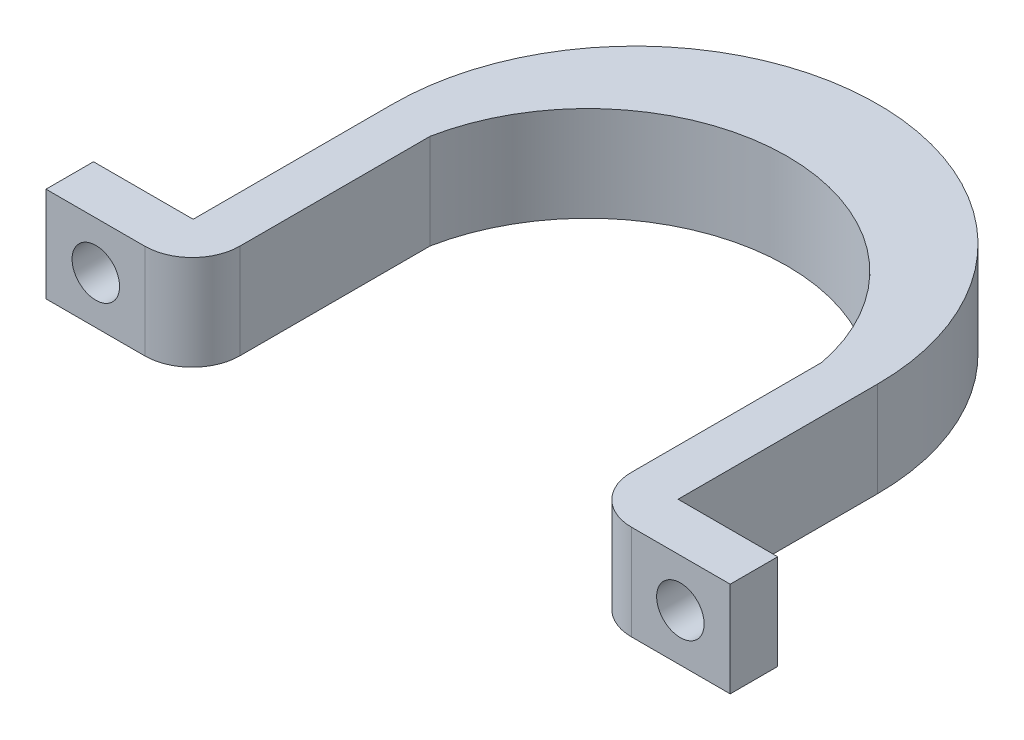
ISO-10303-21;
HEADER;
FILE_DESCRIPTION(('STEP AP214'),'2;1');
FILE_NAME('part.step','',(''),(''),'','','');
FILE_SCHEMA(('AUTOMOTIVE_DESIGN { 1 0 10303 214 1 1 1 1 }'));
ENDSEC;
DATA;
#1=APPLICATION_CONTEXT('core data for automotive mechanical design processes');
#2=APPLICATION_PROTOCOL_DEFINITION('international standard','automotive_design',2000,#1);
#3=PRODUCT_CONTEXT('',#1,'mechanical');
#4=PRODUCT('Part','Part','',(#3));
#5=PRODUCT_RELATED_PRODUCT_CATEGORY('part','',(#4));
#6=PRODUCT_DEFINITION_FORMATION('','',#4);
#7=PRODUCT_DEFINITION_CONTEXT('part definition',#1,'design');
#8=PRODUCT_DEFINITION('design','',#6,#7);
#9=PRODUCT_DEFINITION_SHAPE('','',#8);
#10=(LENGTH_UNIT() NAMED_UNIT(*) SI_UNIT(.MILLI.,.METRE.));
#11=(NAMED_UNIT(*) PLANE_ANGLE_UNIT() SI_UNIT($,.RADIAN.));
#12=(NAMED_UNIT(*) SI_UNIT($,.STERADIAN.) SOLID_ANGLE_UNIT());
#13=UNCERTAINTY_MEASURE_WITH_UNIT(LENGTH_MEASURE(1.E-05),#10,'distance_accuracy_value','');
#14=(GEOMETRIC_REPRESENTATION_CONTEXT(3) GLOBAL_UNCERTAINTY_ASSIGNED_CONTEXT((#13)) GLOBAL_UNIT_ASSIGNED_CONTEXT((#10,
#11,#12)) REPRESENTATION_CONTEXT('',''));
#15=CARTESIAN_POINT('',(0.,0.,0.));
#16=DIRECTION('',(0.,0.,1.));
#17=DIRECTION('',(1.,0.,0.));
#18=AXIS2_PLACEMENT_3D('',#15,#16,#17);
#19=CARTESIAN_POINT('',(0.,10.,-5.));
#20=DIRECTION('',(0.,-1.,0.));
#21=DIRECTION('',(0.,0.,-1.));
#22=AXIS2_PLACEMENT_3D('',#19,#20,#21);
#23=CYLINDRICAL_SURFACE('',#22,25.5147016443462);
#24=CARTESIAN_POINT('',(0.,0.,-5.));
#25=DIRECTION('',(0.,1.,0.));
#26=DIRECTION('',(0.,0.,-1.));
#27=AXIS2_PLACEMENT_3D('',#24,#25,#26);
#28=CIRCLE('',#27,25.5147016443462);
#29=CARTESIAN_POINT('',(25.5147016443462,0.,-5.));
#30=VERTEX_POINT('',#29);
#31=CARTESIAN_POINT('',(-25.5147016443462,0.,-5.));
#32=VERTEX_POINT('',#31);
#33=EDGE_CURVE('E169',#30,#32,#28,.T.);
#34=ORIENTED_EDGE('',*,*,#33,.T.);
#35=DIRECTION('',(0.,-1.,0.));
#36=VECTOR('',#35,1.);
#37=CARTESIAN_POINT('',(-25.5147016443462,10.,-5.));
#38=LINE('',#37,#36);
#39=CARTESIAN_POINT('',(-25.5147016443462,10.,-5.));
#40=VERTEX_POINT('',#39);
#41=EDGE_CURVE('E11',#40,#32,#38,.T.);
#42=ORIENTED_EDGE('',*,*,#41,.F.);
#43=CARTESIAN_POINT('',(0.,10.,-5.));
#44=DIRECTION('',(0.,1.,0.));
#45=DIRECTION('',(0.,0.,-1.));
#46=AXIS2_PLACEMENT_3D('',#43,#44,#45);
#47=CIRCLE('',#46,25.5147016443462);
#48=CARTESIAN_POINT('',(25.5147016443462,10.,-5.));
#49=VERTEX_POINT('',#48);
#50=EDGE_CURVE('E196',#49,#40,#47,.T.);
#51=ORIENTED_EDGE('',*,*,#50,.F.);
#52=DIRECTION('',(0.,-1.,0.));
#53=VECTOR('',#52,1.);
#54=CARTESIAN_POINT('',(25.5147016443462,10.,-5.));
#55=LINE('',#54,#53);
#56=EDGE_CURVE('E165',#49,#30,#55,.T.);
#57=ORIENTED_EDGE('',*,*,#56,.T.);
#58=EDGE_LOOP('',(#34,#42,#51,#57));
#59=FACE_BOUND('',#58,.T.);
#60=ADVANCED_FACE('F37',(#59),#23,.T.);
#61=CARTESIAN_POINT('',(-25.5147016443461,10.,16.));
#62=DIRECTION('',(1.,0.,0.));
#63=DIRECTION('',(0.,0.,-1.));
#64=AXIS2_PLACEMENT_3D('',#61,#62,#63);
#65=PLANE('',#64);
#66=DIRECTION('',(0.,0.,1.));
#67=VECTOR('',#66,1.);
#68=CARTESIAN_POINT('',(-25.5147016443461,0.,16.));
#69=LINE('',#68,#67);
#70=CARTESIAN_POINT('',(-25.5147016443461,0.,16.));
#71=VERTEX_POINT('',#70);
#72=EDGE_CURVE('E172',#32,#71,#69,.T.);
#73=ORIENTED_EDGE('',*,*,#72,.T.);
#74=DIRECTION('',(0.,-1.,0.));
#75=VECTOR('',#74,1.);
#76=CARTESIAN_POINT('',(-25.5147016443461,10.,16.));
#77=LINE('',#76,#75);
#78=CARTESIAN_POINT('',(-25.5147016443461,10.,16.));
#79=VERTEX_POINT('',#78);
#80=EDGE_CURVE('E45',#79,#71,#77,.T.);
#81=ORIENTED_EDGE('',*,*,#80,.F.);
#82=DIRECTION('',(0.,0.,1.));
#83=VECTOR('',#82,1.);
#84=CARTESIAN_POINT('',(-25.5147016443461,10.,16.));
#85=LINE('',#84,#83);
#86=EDGE_CURVE('E114',#40,#79,#85,.T.);
#87=ORIENTED_EDGE('',*,*,#86,.F.);
#88=ORIENTED_EDGE('',*,*,#41,.T.);
#89=EDGE_LOOP('',(#73,#81,#87,#88));
#90=FACE_BOUND('',#89,.T.);
#91=ADVANCED_FACE('F285',(#90),#65,.F.);
#92=CARTESIAN_POINT('',(-36.,10.,16.));
#93=DIRECTION('',(0.,0.,1.));
#94=DIRECTION('',(1.,0.,0.));
#95=AXIS2_PLACEMENT_3D('',#92,#93,#94);
#96=PLANE('',#95);
#97=CARTESIAN_POINT('',(-30.7573508221732,5.,15.9999999999998));
#98=DIRECTION('',(0.,0.,-1.));
#99=DIRECTION('',(1.,0.,0.));
#100=AXIS2_PLACEMENT_3D('',#97,#98,#99);
#101=CIRCLE('',#100,2.5);
#102=CARTESIAN_POINT('',(-28.2573508221732,5.,15.9999999999998));
#103=VERTEX_POINT('',#102);
#104=EDGE_CURVE('E475',#103,#103,#101,.T.);
#105=ORIENTED_EDGE('',*,*,#104,.F.);
#106=EDGE_LOOP('',(#105));
#107=FACE_BOUND('',#106,.T.);
#108=DIRECTION('',(-1.,0.,0.));
#109=VECTOR('',#108,1.);
#110=CARTESIAN_POINT('',(-36.,0.,16.));
#111=LINE('',#110,#109);
#112=CARTESIAN_POINT('',(-36.,0.,16.));
#113=VERTEX_POINT('',#112);
#114=EDGE_CURVE('E175',#71,#113,#111,.T.);
#115=ORIENTED_EDGE('',*,*,#114,.T.);
#116=DIRECTION('',(0.,-1.,0.));
#117=VECTOR('',#116,1.);
#118=CARTESIAN_POINT('',(-36.,10.,16.));
#119=LINE('',#118,#117);
#120=CARTESIAN_POINT('',(-36.,10.,16.));
#121=VERTEX_POINT('',#120);
#122=EDGE_CURVE('E221',#121,#113,#119,.T.);
#123=ORIENTED_EDGE('',*,*,#122,.F.);
#124=DIRECTION('',(-1.,0.,0.));
#125=VECTOR('',#124,1.);
#126=CARTESIAN_POINT('',(-36.,10.,16.));
#127=LINE('',#126,#125);
#128=EDGE_CURVE('E229',#79,#121,#127,.T.);
#129=ORIENTED_EDGE('',*,*,#128,.F.);
#130=ORIENTED_EDGE('',*,*,#80,.T.);
#131=EDGE_LOOP('',(#115,#123,#129,#130));
#132=FACE_BOUND('',#131,.T.);
#133=ADVANCED_FACE('F227',(#107,#132),#96,.F.);
#134=CARTESIAN_POINT('',(-36.,10.,21.));
#135=DIRECTION('',(1.,0.,0.));
#136=DIRECTION('',(0.,0.,-1.));
#137=AXIS2_PLACEMENT_3D('',#134,#135,#136);
#138=PLANE('',#137);
#139=DIRECTION('',(0.,0.,1.));
#140=VECTOR('',#139,1.);
#141=CARTESIAN_POINT('',(-36.,0.,21.));
#142=LINE('',#141,#140);
#143=CARTESIAN_POINT('',(-36.,0.,21.));
#144=VERTEX_POINT('',#143);
#145=EDGE_CURVE('E177',#113,#144,#142,.T.);
#146=ORIENTED_EDGE('',*,*,#145,.T.);
#147=DIRECTION('',(0.,-1.,0.));
#148=VECTOR('',#147,1.);
#149=CARTESIAN_POINT('',(-36.,10.,21.));
#150=LINE('',#149,#148);
#151=CARTESIAN_POINT('',(-36.,10.,21.));
#152=VERTEX_POINT('',#151);
#153=EDGE_CURVE('E218',#152,#144,#150,.T.);
#154=ORIENTED_EDGE('',*,*,#153,.F.);
#155=DIRECTION('',(0.,0.,1.));
#156=VECTOR('',#155,1.);
#157=CARTESIAN_POINT('',(-36.,10.,21.));
#158=LINE('',#157,#156);
#159=EDGE_CURVE('E247',#121,#152,#158,.T.);
#160=ORIENTED_EDGE('',*,*,#159,.F.);
#161=ORIENTED_EDGE('',*,*,#122,.T.);
#162=EDGE_LOOP('',(#146,#154,#160,#161));
#163=FACE_BOUND('',#162,.T.);
#164=ADVANCED_FACE('F238',(#163),#138,.F.);
#165=CARTESIAN_POINT('',(-25.6080282512027,10.,21.));
#166=DIRECTION('',(0.,0.,-1.));
#167=DIRECTION('',(-1.,0.,0.));
#168=AXIS2_PLACEMENT_3D('',#165,#166,#167);
#169=PLANE('',#168);
#170=CARTESIAN_POINT('',(-30.7573508221732,5.,21.));
#171=DIRECTION('',(0.,0.,-1.));
#172=DIRECTION('',(1.,0.,0.));
#173=AXIS2_PLACEMENT_3D('',#170,#171,#172);
#174=CIRCLE('',#173,2.5);
#175=CARTESIAN_POINT('',(-28.2573508221732,5.,21.));
#176=VERTEX_POINT('',#175);
#177=EDGE_CURVE('E472',#176,#176,#174,.T.);
#178=ORIENTED_EDGE('',*,*,#177,.T.);
#179=EDGE_LOOP('',(#178));
#180=FACE_BOUND('',#179,.T.);
#181=DIRECTION('',(1.,0.,0.));
#182=VECTOR('',#181,1.);
#183=CARTESIAN_POINT('',(-25.6080282512027,0.,21.));
#184=LINE('',#183,#182);
#185=CARTESIAN_POINT('',(-25.6080282512027,0.,21.));
#186=VERTEX_POINT('',#185);
#187=EDGE_CURVE('E179',#144,#186,#184,.T.);
#188=ORIENTED_EDGE('',*,*,#187,.T.);
#189=DIRECTION('',(0.,-1.,0.));
#190=VECTOR('',#189,1.);
#191=CARTESIAN_POINT('',(-25.6080282512027,10.,21.));
#192=LINE('',#191,#190);
#193=CARTESIAN_POINT('',(-25.6080282512027,10.,21.));
#194=VERTEX_POINT('',#193);
#195=EDGE_CURVE('E215',#194,#186,#192,.T.);
#196=ORIENTED_EDGE('',*,*,#195,.F.);
#197=DIRECTION('',(1.,0.,0.));
#198=VECTOR('',#197,1.);
#199=CARTESIAN_POINT('',(-25.6080282512027,10.,21.));
#200=LINE('',#199,#198);
#201=EDGE_CURVE('E244',#152,#194,#200,.T.);
#202=ORIENTED_EDGE('',*,*,#201,.F.);
#203=ORIENTED_EDGE('',*,*,#153,.T.);
#204=EDGE_LOOP('',(#188,#196,#202,#203));
#205=FACE_BOUND('',#204,.T.);
#206=ADVANCED_FACE('F242',(#180,#205),#169,.F.);
#207=CARTESIAN_POINT('',(-25.6080282512027,10.,16.));
#208=DIRECTION('',(0.,-1.,0.));
#209=DIRECTION('',(0.,0.,-1.));
#210=AXIS2_PLACEMENT_3D('',#207,#208,#209);
#211=CYLINDRICAL_SURFACE('',#210,5.);
#212=CARTESIAN_POINT('',(-25.6080282512027,0.,16.));
#213=DIRECTION('',(0.,1.,0.));
#214=DIRECTION('',(0.,0.,-1.));
#215=AXIS2_PLACEMENT_3D('',#212,#213,#214);
#216=CIRCLE('',#215,5.);
#217=CARTESIAN_POINT('',(-20.6080282512027,0.,16.));
#218=VERTEX_POINT('',#217);
#219=EDGE_CURVE('E181',#186,#218,#216,.T.);
#220=ORIENTED_EDGE('',*,*,#219,.T.);
#221=DIRECTION('',(0.,-1.,0.));
#222=VECTOR('',#221,1.);
#223=CARTESIAN_POINT('',(-20.6080282512027,10.,16.));
#224=LINE('',#223,#222);
#225=CARTESIAN_POINT('',(-20.6080282512027,10.,16.));
#226=VERTEX_POINT('',#225);
#227=EDGE_CURVE('E212',#226,#218,#224,.T.);
#228=ORIENTED_EDGE('',*,*,#227,.F.);
#229=CARTESIAN_POINT('',(-25.6080282512027,10.,16.));
#230=DIRECTION('',(0.,1.,0.));
#231=DIRECTION('',(0.,0.,-1.));
#232=AXIS2_PLACEMENT_3D('',#229,#230,#231);
#233=CIRCLE('',#232,5.);
#234=EDGE_CURVE('E246',#194,#226,#233,.T.);
#235=ORIENTED_EDGE('',*,*,#234,.F.);
#236=ORIENTED_EDGE('',*,*,#195,.T.);
#237=EDGE_LOOP('',(#220,#228,#235,#236));
#238=FACE_BOUND('',#237,.T.);
#239=ADVANCED_FACE('F299',(#238),#211,.T.);
#240=CARTESIAN_POINT('',(-20.6080282512027,10.,-4.03846153846154));
#241=DIRECTION('',(-1.,0.,0.));
#242=DIRECTION('',(0.,0.,1.));
#243=AXIS2_PLACEMENT_3D('',#240,#241,#242);
#244=PLANE('',#243);
#245=DIRECTION('',(0.,0.,-1.));
#246=VECTOR('',#245,1.);
#247=CARTESIAN_POINT('',(-20.6080282512027,0.,-4.03846153846154));
#248=LINE('',#247,#246);
#249=CARTESIAN_POINT('',(-20.6080282512027,0.,-4.03846153846154));
#250=VERTEX_POINT('',#249);
#251=EDGE_CURVE('E183',#218,#250,#248,.T.);
#252=ORIENTED_EDGE('',*,*,#251,.T.);
#253=DIRECTION('',(0.,-1.,0.));
#254=VECTOR('',#253,1.);
#255=CARTESIAN_POINT('',(-20.6080282512027,10.,-4.03846153846154));
#256=LINE('',#255,#254);
#257=CARTESIAN_POINT('',(-20.6080282512027,10.,-4.03846153846154));
#258=VERTEX_POINT('',#257);
#259=EDGE_CURVE('E209',#258,#250,#256,.T.);
#260=ORIENTED_EDGE('',*,*,#259,.F.);
#261=DIRECTION('',(0.,0.,-1.));
#262=VECTOR('',#261,1.);
#263=CARTESIAN_POINT('',(-20.6080282512027,10.,-4.03846153846154));
#264=LINE('',#263,#262);
#265=EDGE_CURVE('E249',#226,#258,#264,.T.);
#266=ORIENTED_EDGE('',*,*,#265,.F.);
#267=ORIENTED_EDGE('',*,*,#227,.T.);
#268=EDGE_LOOP('',(#252,#260,#266,#267));
#269=FACE_BOUND('',#268,.T.);
#270=ADVANCED_FACE('F303',(#269),#244,.F.);
#271=CARTESIAN_POINT('',(0.,10.,0.));
#272=DIRECTION('',(0.,-1.,0.));
#273=DIRECTION('',(0.,0.,-1.));
#274=AXIS2_PLACEMENT_3D('',#271,#272,#273);
#275=CYLINDRICAL_SURFACE('',#274,21.);
#276=CARTESIAN_POINT('',(0.,0.,0.));
#277=DIRECTION('',(0.,-1.,0.));
#278=DIRECTION('',(0.,0.,-1.));
#279=AXIS2_PLACEMENT_3D('',#276,#277,#278);
#280=CIRCLE('',#279,21.);
#281=CARTESIAN_POINT('',(20.6080282512027,0.,-4.03846153846154));
#282=VERTEX_POINT('',#281);
#283=EDGE_CURVE('E185',#250,#282,#280,.T.);
#284=ORIENTED_EDGE('',*,*,#283,.T.);
#285=DIRECTION('',(0.,-1.,0.));
#286=VECTOR('',#285,1.);
#287=CARTESIAN_POINT('',(20.6080282512027,10.,-4.03846153846154));
#288=LINE('',#287,#286);
#289=CARTESIAN_POINT('',(20.6080282512027,10.,-4.03846153846154));
#290=VERTEX_POINT('',#289);
#291=EDGE_CURVE('E206',#290,#282,#288,.T.);
#292=ORIENTED_EDGE('',*,*,#291,.F.);
#293=CARTESIAN_POINT('',(0.,10.,0.));
#294=DIRECTION('',(0.,-1.,0.));
#295=DIRECTION('',(0.,0.,-1.));
#296=AXIS2_PLACEMENT_3D('',#293,#294,#295);
#297=CIRCLE('',#296,21.);
#298=EDGE_CURVE('E255',#258,#290,#297,.T.);
#299=ORIENTED_EDGE('',*,*,#298,.F.);
#300=ORIENTED_EDGE('',*,*,#259,.T.);
#301=EDGE_LOOP('',(#284,#292,#299,#300));
#302=FACE_BOUND('',#301,.T.);
#303=ADVANCED_FACE('F307',(#302),#275,.F.);
#304=CARTESIAN_POINT('',(20.6080282512027,10.,-4.03846153846154));
#305=DIRECTION('',(1.,0.,0.));
#306=DIRECTION('',(0.,0.,-1.));
#307=AXIS2_PLACEMENT_3D('',#304,#305,#306);
#308=PLANE('',#307);
#309=DIRECTION('',(0.,0.,1.));
#310=VECTOR('',#309,1.);
#311=CARTESIAN_POINT('',(20.6080282512027,0.,-4.03846153846154));
#312=LINE('',#311,#310);
#313=CARTESIAN_POINT('',(20.6080282512028,0.,15.9999999999998));
#314=VERTEX_POINT('',#313);
#315=EDGE_CURVE('E187',#282,#314,#312,.T.);
#316=ORIENTED_EDGE('',*,*,#315,.T.);
#317=DIRECTION('',(0.,-1.,0.));
#318=VECTOR('',#317,1.);
#319=CARTESIAN_POINT('',(20.6080282512028,10.,15.9999999999998));
#320=LINE('',#319,#318);
#321=CARTESIAN_POINT('',(20.6080282512028,10.,15.9999999999998));
#322=VERTEX_POINT('',#321);
#323=EDGE_CURVE('E203',#322,#314,#320,.T.);
#324=ORIENTED_EDGE('',*,*,#323,.F.);
#325=DIRECTION('',(0.,0.,1.));
#326=VECTOR('',#325,1.);
#327=CARTESIAN_POINT('',(20.6080282512027,10.,-4.03846153846154));
#328=LINE('',#327,#326);
#329=EDGE_CURVE('E257',#290,#322,#328,.T.);
#330=ORIENTED_EDGE('',*,*,#329,.F.);
#331=ORIENTED_EDGE('',*,*,#291,.T.);
#332=EDGE_LOOP('',(#316,#324,#330,#331));
#333=FACE_BOUND('',#332,.T.);
#334=ADVANCED_FACE('F311',(#333),#308,.F.);
#335=CARTESIAN_POINT('',(25.6080282512028,10.,15.9999999999998));
#336=DIRECTION('',(0.,-1.,0.));
#337=DIRECTION('',(0.,0.,-1.));
#338=AXIS2_PLACEMENT_3D('',#335,#336,#337);
#339=CYLINDRICAL_SURFACE('',#338,5.);
#340=CARTESIAN_POINT('',(25.6080282512028,0.,15.9999999999998));
#341=DIRECTION('',(0.,1.,0.));
#342=DIRECTION('',(0.,0.,1.));
#343=AXIS2_PLACEMENT_3D('',#340,#341,#342);
#344=CIRCLE('',#343,5.);
#345=CARTESIAN_POINT('',(25.6080282512028,0.,20.9999999999998));
#346=VERTEX_POINT('',#345);
#347=EDGE_CURVE('E189',#314,#346,#344,.T.);
#348=ORIENTED_EDGE('',*,*,#347,.T.);
#349=DIRECTION('',(0.,-1.,0.));
#350=VECTOR('',#349,1.);
#351=CARTESIAN_POINT('',(25.6080282512028,10.,20.9999999999998));
#352=LINE('',#351,#350);
#353=CARTESIAN_POINT('',(25.6080282512028,10.,20.9999999999998));
#354=VERTEX_POINT('',#353);
#355=EDGE_CURVE('E200',#354,#346,#352,.T.);
#356=ORIENTED_EDGE('',*,*,#355,.F.);
#357=CARTESIAN_POINT('',(25.6080282512028,10.,15.9999999999998));
#358=DIRECTION('',(0.,1.,0.));
#359=DIRECTION('',(0.,0.,1.));
#360=AXIS2_PLACEMENT_3D('',#357,#358,#359);
#361=CIRCLE('',#360,5.);
#362=EDGE_CURVE('E259',#322,#354,#361,.T.);
#363=ORIENTED_EDGE('',*,*,#362,.F.);
#364=ORIENTED_EDGE('',*,*,#323,.T.);
#365=EDGE_LOOP('',(#348,#356,#363,#364));
#366=FACE_BOUND('',#365,.T.);
#367=ADVANCED_FACE('F265',(#366),#339,.T.);
#368=CARTESIAN_POINT('',(25.6080282512028,10.,20.9999999999998));
#369=DIRECTION('',(0.,0.,-1.));
#370=DIRECTION('',(-1.,0.,0.));
#371=AXIS2_PLACEMENT_3D('',#368,#369,#370);
#372=PLANE('',#371);
#373=CARTESIAN_POINT('',(30.7573508221732,5.,21.));
#374=DIRECTION('',(0.,0.,-1.));
#375=DIRECTION('',(-1.,0.,0.));
#376=AXIS2_PLACEMENT_3D('',#373,#374,#375);
#377=CIRCLE('',#376,2.5);
#378=CARTESIAN_POINT('',(28.2573508221732,5.,21.));
#379=VERTEX_POINT('',#378);
#380=EDGE_CURVE('E173',#379,#379,#377,.T.);
#381=ORIENTED_EDGE('',*,*,#380,.T.);
#382=EDGE_LOOP('',(#381));
#383=FACE_BOUND('',#382,.T.);
#384=DIRECTION('',(1.,0.,0.));
#385=VECTOR('',#384,1.);
#386=CARTESIAN_POINT('',(25.6080282512028,0.,20.9999999999998));
#387=LINE('',#386,#385);
#388=CARTESIAN_POINT('',(36.0000000000001,0.,20.9999999999998));
#389=VERTEX_POINT('',#388);
#390=EDGE_CURVE('E191',#346,#389,#387,.T.);
#391=ORIENTED_EDGE('',*,*,#390,.T.);
#392=DIRECTION('',(0.,-1.,0.));
#393=VECTOR('',#392,1.);
#394=CARTESIAN_POINT('',(36.0000000000001,10.,20.9999999999998));
#395=LINE('',#394,#393);
#396=CARTESIAN_POINT('',(36.0000000000001,10.,20.9999999999998));
#397=VERTEX_POINT('',#396);
#398=EDGE_CURVE('E160',#397,#389,#395,.T.);
#399=ORIENTED_EDGE('',*,*,#398,.F.);
#400=DIRECTION('',(1.,0.,0.));
#401=VECTOR('',#400,1.);
#402=CARTESIAN_POINT('',(25.6080282512028,10.,20.9999999999998));
#403=LINE('',#402,#401);
#404=EDGE_CURVE('E151',#354,#397,#403,.T.);
#405=ORIENTED_EDGE('',*,*,#404,.F.);
#406=ORIENTED_EDGE('',*,*,#355,.T.);
#407=EDGE_LOOP('',(#391,#399,#405,#406));
#408=FACE_BOUND('',#407,.T.);
#409=ADVANCED_FACE('F269',(#383,#408),#372,.F.);
#410=CARTESIAN_POINT('',(36.0000000000001,10.,20.9999999999998));
#411=DIRECTION('',(-1.,0.,0.));
#412=DIRECTION('',(0.,0.,1.));
#413=AXIS2_PLACEMENT_3D('',#410,#411,#412);
#414=PLANE('',#413);
#415=DIRECTION('',(0.,0.,-1.));
#416=VECTOR('',#415,1.);
#417=CARTESIAN_POINT('',(36.0000000000001,0.,20.9999999999998));
#418=LINE('',#417,#416);
#419=CARTESIAN_POINT('',(36.0000000000001,0.,15.9999999999998));
#420=VERTEX_POINT('',#419);
#421=EDGE_CURVE('E159',#389,#420,#418,.T.);
#422=ORIENTED_EDGE('',*,*,#421,.T.);
#423=DIRECTION('',(0.,-1.,0.));
#424=VECTOR('',#423,1.);
#425=CARTESIAN_POINT('',(36.0000000000001,10.,15.9999999999998));
#426=LINE('',#425,#424);
#427=CARTESIAN_POINT('',(36.0000000000001,10.,15.9999999999998));
#428=VERTEX_POINT('',#427);
#429=EDGE_CURVE('E156',#428,#420,#426,.T.);
#430=ORIENTED_EDGE('',*,*,#429,.F.);
#431=DIRECTION('',(0.,0.,-1.));
#432=VECTOR('',#431,1.);
#433=CARTESIAN_POINT('',(36.0000000000001,10.,20.9999999999998));
#434=LINE('',#433,#432);
#435=EDGE_CURVE('E145',#397,#428,#434,.T.);
#436=ORIENTED_EDGE('',*,*,#435,.F.);
#437=ORIENTED_EDGE('',*,*,#398,.T.);
#438=EDGE_LOOP('',(#422,#430,#436,#437));
#439=FACE_BOUND('',#438,.T.);
#440=ADVANCED_FACE('F157',(#439),#414,.F.);
#441=CARTESIAN_POINT('',(36.0000000000001,10.,15.9999999999998));
#442=DIRECTION('',(0.,0.,1.));
#443=DIRECTION('',(1.,0.,0.));
#444=AXIS2_PLACEMENT_3D('',#441,#442,#443);
#445=PLANE('',#444);
#446=CARTESIAN_POINT('',(30.7573508221732,5.,15.9999999999998));
#447=DIRECTION('',(0.,0.,-1.));
#448=DIRECTION('',(-1.,0.,0.));
#449=AXIS2_PLACEMENT_3D('',#446,#447,#448);
#450=CIRCLE('',#449,2.5);
#451=CARTESIAN_POINT('',(28.2573508221732,5.,15.9999999999998));
#452=VERTEX_POINT('',#451);
#453=EDGE_CURVE('E476',#452,#452,#450,.T.);
#454=ORIENTED_EDGE('',*,*,#453,.F.);
#455=EDGE_LOOP('',(#454));
#456=FACE_BOUND('',#455,.T.);
#457=DIRECTION('',(-1.,0.,0.));
#458=VECTOR('',#457,1.);
#459=CARTESIAN_POINT('',(36.0000000000001,0.,15.9999999999998));
#460=LINE('',#459,#458);
#461=CARTESIAN_POINT('',(25.5147016443462,0.,15.9999999999998));
#462=VERTEX_POINT('',#461);
#463=EDGE_CURVE('E100',#420,#462,#460,.T.);
#464=ORIENTED_EDGE('',*,*,#463,.T.);
#465=DIRECTION('',(0.,-1.,0.));
#466=VECTOR('',#465,1.);
#467=CARTESIAN_POINT('',(25.5147016443462,10.,15.9999999999998));
#468=LINE('',#467,#466);
#469=CARTESIAN_POINT('',(25.5147016443462,10.,15.9999999999998));
#470=VERTEX_POINT('',#469);
#471=EDGE_CURVE('E161',#470,#462,#468,.T.);
#472=ORIENTED_EDGE('',*,*,#471,.F.);
#473=DIRECTION('',(-1.,0.,0.));
#474=VECTOR('',#473,1.);
#475=CARTESIAN_POINT('',(36.0000000000001,10.,15.9999999999998));
#476=LINE('',#475,#474);
#477=EDGE_CURVE('E149',#428,#470,#476,.T.);
#478=ORIENTED_EDGE('',*,*,#477,.F.);
#479=ORIENTED_EDGE('',*,*,#429,.T.);
#480=EDGE_LOOP('',(#464,#472,#478,#479));
#481=FACE_BOUND('',#480,.T.);
#482=ADVANCED_FACE('F163',(#456,#481),#445,.F.);
#483=CARTESIAN_POINT('',(25.5147016443462,10.,15.9999999999998));
#484=DIRECTION('',(-1.,0.,0.));
#485=DIRECTION('',(0.,0.,1.));
#486=AXIS2_PLACEMENT_3D('',#483,#484,#485);
#487=PLANE('',#486);
#488=DIRECTION('',(0.,0.,-1.));
#489=VECTOR('',#488,1.);
#490=CARTESIAN_POINT('',(25.5147016443462,0.,15.9999999999998));
#491=LINE('',#490,#489);
#492=EDGE_CURVE('E106',#462,#30,#491,.T.);
#493=ORIENTED_EDGE('',*,*,#492,.T.);
#494=ORIENTED_EDGE('',*,*,#56,.F.);
#495=DIRECTION('',(0.,0.,-1.));
#496=VECTOR('',#495,1.);
#497=CARTESIAN_POINT('',(25.5147016443462,10.,15.9999999999998));
#498=LINE('',#497,#496);
#499=EDGE_CURVE('E53',#470,#49,#498,.T.);
#500=ORIENTED_EDGE('',*,*,#499,.F.);
#501=ORIENTED_EDGE('',*,*,#471,.T.);
#502=EDGE_LOOP('',(#493,#494,#500,#501));
#503=FACE_BOUND('',#502,.T.);
#504=ADVANCED_FACE('F273',(#503),#487,.F.);
#505=CARTESIAN_POINT('',(0.,10.,-5.));
#506=DIRECTION('',(0.,-1.,0.));
#507=DIRECTION('',(0.,0.,-1.));
#508=AXIS2_PLACEMENT_3D('',#505,#506,#507);
#509=PLANE('',#508);
#510=ORIENTED_EDGE('',*,*,#50,.T.);
#511=ORIENTED_EDGE('',*,*,#86,.T.);
#512=ORIENTED_EDGE('',*,*,#128,.T.);
#513=ORIENTED_EDGE('',*,*,#159,.T.);
#514=ORIENTED_EDGE('',*,*,#201,.T.);
#515=ORIENTED_EDGE('',*,*,#234,.T.);
#516=ORIENTED_EDGE('',*,*,#265,.T.);
#517=ORIENTED_EDGE('',*,*,#298,.T.);
#518=ORIENTED_EDGE('',*,*,#329,.T.);
#519=ORIENTED_EDGE('',*,*,#362,.T.);
#520=ORIENTED_EDGE('',*,*,#404,.T.);
#521=ORIENTED_EDGE('',*,*,#435,.T.);
#522=ORIENTED_EDGE('',*,*,#477,.T.);
#523=ORIENTED_EDGE('',*,*,#499,.T.);
#524=EDGE_LOOP('',(#510,#511,#512,#513,#514,#515,#516,#517,#518,#519,#520,#521,#522,#523));
#525=FACE_BOUND('',#524,.T.);
#526=ADVANCED_FACE('F147',(#525),#509,.F.);
#527=CARTESIAN_POINT('',(0.,0.,-5.));
#528=DIRECTION('',(0.,-1.,0.));
#529=DIRECTION('',(0.,0.,-1.));
#530=AXIS2_PLACEMENT_3D('',#527,#528,#529);
#531=PLANE('',#530);
#532=ORIENTED_EDGE('',*,*,#33,.F.);
#533=ORIENTED_EDGE('',*,*,#492,.F.);
#534=ORIENTED_EDGE('',*,*,#463,.F.);
#535=ORIENTED_EDGE('',*,*,#421,.F.);
#536=ORIENTED_EDGE('',*,*,#390,.F.);
#537=ORIENTED_EDGE('',*,*,#347,.F.);
#538=ORIENTED_EDGE('',*,*,#315,.F.);
#539=ORIENTED_EDGE('',*,*,#283,.F.);
#540=ORIENTED_EDGE('',*,*,#251,.F.);
#541=ORIENTED_EDGE('',*,*,#219,.F.);
#542=ORIENTED_EDGE('',*,*,#187,.F.);
#543=ORIENTED_EDGE('',*,*,#145,.F.);
#544=ORIENTED_EDGE('',*,*,#114,.F.);
#545=ORIENTED_EDGE('',*,*,#72,.F.);
#546=EDGE_LOOP('',(#532,#533,#534,#535,#536,#537,#538,#539,#540,#541,#542,#543,#544,#545));
#547=FACE_BOUND('',#546,.T.);
#548=ADVANCED_FACE('F233',(#547),#531,.T.);
#549=CARTESIAN_POINT('',(30.7573508221732,5.,21.));
#550=DIRECTION('',(0.,0.,-1.));
#551=DIRECTION('',(-1.,0.,0.));
#552=AXIS2_PLACEMENT_3D('',#549,#550,#551);
#553=CYLINDRICAL_SURFACE('',#552,2.5);
#554=ORIENTED_EDGE('',*,*,#380,.F.);
#555=EDGE_LOOP('',(#554));
#556=FACE_BOUND('',#555,.T.);
#557=ORIENTED_EDGE('',*,*,#453,.T.);
#558=EDGE_LOOP('',(#557));
#559=FACE_BOUND('',#558,.T.);
#560=ADVANCED_FACE('F341',(#556,#559),#553,.F.);
#561=CARTESIAN_POINT('',(-30.7573508221732,5.,21.));
#562=DIRECTION('',(0.,0.,-1.));
#563=DIRECTION('',(-1.,0.,0.));
#564=AXIS2_PLACEMENT_3D('',#561,#562,#563);
#565=CYLINDRICAL_SURFACE('',#564,2.5);
#566=ORIENTED_EDGE('',*,*,#177,.F.);
#567=EDGE_LOOP('',(#566));
#568=FACE_BOUND('',#567,.T.);
#569=ORIENTED_EDGE('',*,*,#104,.T.);
#570=EDGE_LOOP('',(#569));
#571=FACE_BOUND('',#570,.T.);
#572=ADVANCED_FACE('F346',(#568,#571),#565,.F.);
#573=CLOSED_SHELL('',(#60,#91,#133,#164,#206,#239,#270,#303,#334,#367,#409,#440,#482,#504,#526,
#548,#560,#572));
#574=MANIFOLD_SOLID_BREP('B2',#573);
#575=ADVANCED_BREP_SHAPE_REPRESENTATION('',(#18,#574),#14);
#576=SHAPE_DEFINITION_REPRESENTATION(#9,#575);
ENDSEC;
END-ISO-10303-21;
